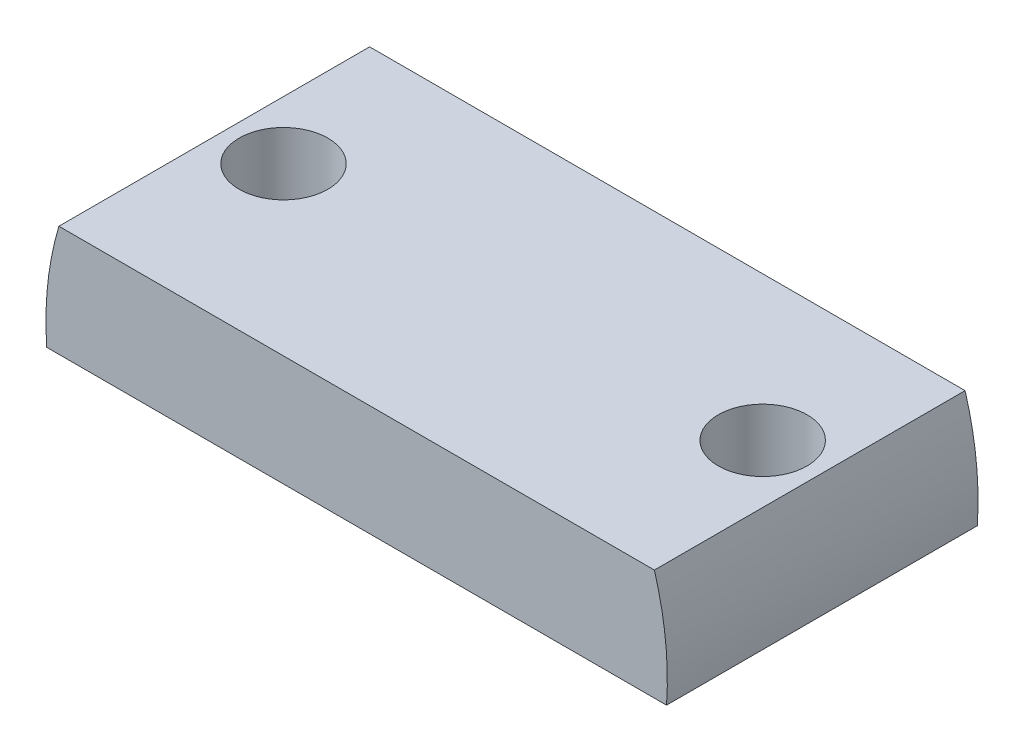
ISO-10303-21;
HEADER;
FILE_DESCRIPTION(('STEP AP214'),'2;1');
FILE_NAME('part.step','',(''),(''),'','','');
FILE_SCHEMA(('AUTOMOTIVE_DESIGN { 1 0 10303 214 1 1 1 1 }'));
ENDSEC;
DATA;
#1=APPLICATION_CONTEXT('core data for automotive mechanical design processes');
#2=APPLICATION_PROTOCOL_DEFINITION('international standard','automotive_design',2000,#1);
#3=PRODUCT_CONTEXT('',#1,'mechanical');
#4=PRODUCT('Part','Part','',(#3));
#5=PRODUCT_RELATED_PRODUCT_CATEGORY('part','',(#4));
#6=PRODUCT_DEFINITION_FORMATION('','',#4);
#7=PRODUCT_DEFINITION_CONTEXT('part definition',#1,'design');
#8=PRODUCT_DEFINITION('design','',#6,#7);
#9=PRODUCT_DEFINITION_SHAPE('','',#8);
#10=(LENGTH_UNIT() NAMED_UNIT(*) SI_UNIT(.MILLI.,.METRE.));
#11=(NAMED_UNIT(*) PLANE_ANGLE_UNIT() SI_UNIT($,.RADIAN.));
#12=(NAMED_UNIT(*) SI_UNIT($,.STERADIAN.) SOLID_ANGLE_UNIT());
#13=UNCERTAINTY_MEASURE_WITH_UNIT(LENGTH_MEASURE(1.E-05),#10,'distance_accuracy_value','');
#14=(GEOMETRIC_REPRESENTATION_CONTEXT(3) GLOBAL_UNCERTAINTY_ASSIGNED_CONTEXT((#13)) GLOBAL_UNIT_ASSIGNED_CONTEXT((#10,
#11,#12)) REPRESENTATION_CONTEXT('',''));
#15=CARTESIAN_POINT('',(0.,0.,0.));
#16=DIRECTION('',(0.,0.,1.));
#17=DIRECTION('',(1.,0.,0.));
#18=AXIS2_PLACEMENT_3D('',#15,#16,#17);
#19=CARTESIAN_POINT('',(0.,3.99956576018979,15.));
#20=DIRECTION('',(0.,-1.,0.));
#21=DIRECTION('',(1.,0.,0.));
#22=AXIS2_PLACEMENT_3D('',#19,#20,#21);
#23=PLANE('',#22);
#24=CARTESIAN_POINT('',(10.795,3.99956576018979,7.5));
#25=DIRECTION('',(0.,1.,0.));
#26=DIRECTION('',(0.,0.,1.));
#27=AXIS2_PLACEMENT_3D('',#24,#25,#26);
#28=CIRCLE('',#27,2.);
#29=CARTESIAN_POINT('',(10.795,3.99956576018979,9.5));
#30=VERTEX_POINT('',#29);
#31=EDGE_CURVE('E127',#30,#30,#28,.T.);
#32=ORIENTED_EDGE('',*,*,#31,.F.);
#33=EDGE_LOOP('',(#32));
#34=FACE_BOUND('',#33,.T.);
#35=CARTESIAN_POINT('',(-10.795,3.99956576018979,7.5));
#36=DIRECTION('',(0.,1.,0.));
#37=DIRECTION('',(0.,0.,-1.));
#38=AXIS2_PLACEMENT_3D('',#35,#36,#37);
#39=CIRCLE('',#38,2.);
#40=CARTESIAN_POINT('',(-10.795,3.99956576018979,5.5));
#41=VERTEX_POINT('',#40);
#42=EDGE_CURVE('E130',#41,#41,#39,.T.);
#43=ORIENTED_EDGE('',*,*,#42,.F.);
#44=EDGE_LOOP('',(#43));
#45=FACE_BOUND('',#44,.T.);
#46=DIRECTION('',(0.,0.,-1.));
#47=VECTOR('',#46,1.);
#48=CARTESIAN_POINT('',(13.4149513803975,3.99956576018979,15.));
#49=LINE('',#48,#47);
#50=CARTESIAN_POINT('',(13.4149513803975,3.99956576018979,15.));
#51=VERTEX_POINT('',#50);
#52=CARTESIAN_POINT('',(13.4149513803975,3.99956576018979,1.));
#53=VERTEX_POINT('',#52);
#54=EDGE_CURVE('E84',#51,#53,#49,.T.);
#55=ORIENTED_EDGE('',*,*,#54,.T.);
#56=DIRECTION('',(-1.,0.,0.));
#57=VECTOR('',#56,1.);
#58=CARTESIAN_POINT('',(0.,3.99956576018979,1.));
#59=LINE('',#58,#57);
#60=CARTESIAN_POINT('',(-13.4149513803975,3.99956576018979,1.));
#61=VERTEX_POINT('',#60);
#62=EDGE_CURVE('E47',#53,#61,#59,.T.);
#63=ORIENTED_EDGE('',*,*,#62,.T.);
#64=DIRECTION('',(0.,0.,-1.));
#65=VECTOR('',#64,1.);
#66=CARTESIAN_POINT('',(-13.4149513803975,3.99956576018979,15.));
#67=LINE('',#66,#65);
#68=CARTESIAN_POINT('',(-13.4149513803975,3.99956576018979,15.));
#69=VERTEX_POINT('',#68);
#70=EDGE_CURVE('E11',#69,#61,#67,.T.);
#71=ORIENTED_EDGE('',*,*,#70,.F.);
#72=DIRECTION('',(-1.,0.,0.));
#73=VECTOR('',#72,1.);
#74=CARTESIAN_POINT('',(0.,3.99956576018979,15.));
#75=LINE('',#74,#73);
#76=EDGE_CURVE('E91',#51,#69,#75,.T.);
#77=ORIENTED_EDGE('',*,*,#76,.F.);
#78=EDGE_LOOP('',(#55,#63,#71,#77));
#79=FACE_BOUND('',#78,.T.);
#80=ADVANCED_FACE('F33',(#34,#45,#79),#23,.F.);
#81=CARTESIAN_POINT('',(0.,0.,15.));
#82=DIRECTION('',(0.,0.,-1.));
#83=DIRECTION('',(-1.,0.,0.));
#84=AXIS2_PLACEMENT_3D('',#81,#82,#83);
#85=CYLINDRICAL_SURFACE('',#84,13.9984801606643);
#86=ORIENTED_EDGE('',*,*,#70,.T.);
#87=CARTESIAN_POINT('',(0.,0.,1.));
#88=DIRECTION('',(0.,0.,1.));
#89=DIRECTION('',(1.,0.,0.));
#90=AXIS2_PLACEMENT_3D('',#87,#88,#89);
#91=CIRCLE('',#90,13.9984801606643);
#92=CARTESIAN_POINT('',(-13.9627163119685,-0.999999999999996,1.));
#93=VERTEX_POINT('',#92);
#94=EDGE_CURVE('E71',#61,#93,#91,.T.);
#95=ORIENTED_EDGE('',*,*,#94,.T.);
#96=DIRECTION('',(0.,0.,-1.));
#97=VECTOR('',#96,1.);
#98=CARTESIAN_POINT('',(-13.9627163119685,-0.999999999999996,15.));
#99=LINE('',#98,#97);
#100=CARTESIAN_POINT('',(-13.9627163119685,-0.999999999999996,15.));
#101=VERTEX_POINT('',#100);
#102=EDGE_CURVE('E40',#101,#93,#99,.T.);
#103=ORIENTED_EDGE('',*,*,#102,.F.);
#104=CARTESIAN_POINT('',(0.,0.,15.));
#105=DIRECTION('',(0.,0.,1.));
#106=DIRECTION('',(1.,0.,0.));
#107=AXIS2_PLACEMENT_3D('',#104,#105,#106);
#108=CIRCLE('',#107,13.9984801606643);
#109=EDGE_CURVE('E88',#69,#101,#108,.T.);
#110=ORIENTED_EDGE('',*,*,#109,.F.);
#111=EDGE_LOOP('',(#86,#95,#103,#110));
#112=FACE_BOUND('',#111,.T.);
#113=ADVANCED_FACE('F87',(#112),#85,.T.);
#114=CARTESIAN_POINT('',(0.,-1.,15.));
#115=DIRECTION('',(0.,1.,0.));
#116=DIRECTION('',(-1.,0.,0.));
#117=AXIS2_PLACEMENT_3D('',#114,#115,#116);
#118=PLANE('',#117);
#119=CARTESIAN_POINT('',(10.795,-1.,7.5));
#120=DIRECTION('',(0.,1.,0.));
#121=DIRECTION('',(0.,0.,1.));
#122=AXIS2_PLACEMENT_3D('',#119,#120,#121);
#123=CIRCLE('',#122,2.);
#124=CARTESIAN_POINT('',(10.795,-1.,9.5));
#125=VERTEX_POINT('',#124);
#126=EDGE_CURVE('E132',#125,#125,#123,.T.);
#127=ORIENTED_EDGE('',*,*,#126,.T.);
#128=EDGE_LOOP('',(#127));
#129=FACE_BOUND('',#128,.T.);
#130=CARTESIAN_POINT('',(-10.795,-1.,7.5));
#131=DIRECTION('',(0.,1.,0.));
#132=DIRECTION('',(0.,0.,-1.));
#133=AXIS2_PLACEMENT_3D('',#130,#131,#132);
#134=CIRCLE('',#133,2.);
#135=CARTESIAN_POINT('',(-10.795,-1.,5.5));
#136=VERTEX_POINT('',#135);
#137=EDGE_CURVE('E94',#136,#136,#134,.T.);
#138=ORIENTED_EDGE('',*,*,#137,.T.);
#139=EDGE_LOOP('',(#138));
#140=FACE_BOUND('',#139,.T.);
#141=ORIENTED_EDGE('',*,*,#102,.T.);
#142=DIRECTION('',(1.,0.,0.));
#143=VECTOR('',#142,1.);
#144=CARTESIAN_POINT('',(13.9627163119685,-1.,1.));
#145=LINE('',#144,#143);
#146=CARTESIAN_POINT('',(13.9627163119685,-1.,1.));
#147=VERTEX_POINT('',#146);
#148=EDGE_CURVE('E74',#93,#147,#145,.T.);
#149=ORIENTED_EDGE('',*,*,#148,.T.);
#150=DIRECTION('',(0.,0.,-1.));
#151=VECTOR('',#150,1.);
#152=CARTESIAN_POINT('',(13.9627163119685,-1.,15.));
#153=LINE('',#152,#151);
#154=CARTESIAN_POINT('',(13.9627163119685,-1.,15.));
#155=VERTEX_POINT('',#154);
#156=EDGE_CURVE('E100',#155,#147,#153,.T.);
#157=ORIENTED_EDGE('',*,*,#156,.F.);
#158=DIRECTION('',(1.,0.,0.));
#159=VECTOR('',#158,1.);
#160=CARTESIAN_POINT('',(0.,-1.,15.));
#161=LINE('',#160,#159);
#162=EDGE_CURVE('E90',#101,#155,#161,.T.);
#163=ORIENTED_EDGE('',*,*,#162,.F.);
#164=EDGE_LOOP('',(#141,#149,#157,#163));
#165=FACE_BOUND('',#164,.T.);
#166=ADVANCED_FACE('F103',(#129,#140,#165),#118,.F.);
#167=CARTESIAN_POINT('',(0.,0.,15.));
#168=DIRECTION('',(0.,0.,-1.));
#169=DIRECTION('',(-1.,0.,0.));
#170=AXIS2_PLACEMENT_3D('',#167,#168,#169);
#171=CYLINDRICAL_SURFACE('',#170,13.9984801606643);
#172=ORIENTED_EDGE('',*,*,#156,.T.);
#173=CARTESIAN_POINT('',(0.,0.,1.));
#174=DIRECTION('',(0.,0.,1.));
#175=DIRECTION('',(1.,0.,0.));
#176=AXIS2_PLACEMENT_3D('',#173,#174,#175);
#177=CIRCLE('',#176,13.9984801606643);
#178=EDGE_CURVE('E85',#147,#53,#177,.T.);
#179=ORIENTED_EDGE('',*,*,#178,.T.);
#180=ORIENTED_EDGE('',*,*,#54,.F.);
#181=CARTESIAN_POINT('',(0.,0.,15.));
#182=DIRECTION('',(0.,0.,1.));
#183=DIRECTION('',(1.,0.,0.));
#184=AXIS2_PLACEMENT_3D('',#181,#182,#183);
#185=CIRCLE('',#184,13.9984801606643);
#186=EDGE_CURVE('E55',#155,#51,#185,.T.);
#187=ORIENTED_EDGE('',*,*,#186,.F.);
#188=EDGE_LOOP('',(#172,#179,#180,#187));
#189=FACE_BOUND('',#188,.T.);
#190=ADVANCED_FACE('F108',(#189),#171,.T.);
#191=CARTESIAN_POINT('',(0.,0.,15.));
#192=DIRECTION('',(0.,0.,1.));
#193=DIRECTION('',(1.,0.,0.));
#194=AXIS2_PLACEMENT_3D('',#191,#192,#193);
#195=PLANE('',#194);
#196=ORIENTED_EDGE('',*,*,#76,.T.);
#197=ORIENTED_EDGE('',*,*,#109,.T.);
#198=ORIENTED_EDGE('',*,*,#162,.T.);
#199=ORIENTED_EDGE('',*,*,#186,.T.);
#200=EDGE_LOOP('',(#196,#197,#198,#199));
#201=FACE_BOUND('',#200,.T.);
#202=ADVANCED_FACE('F105',(#201),#195,.T.);
#203=CARTESIAN_POINT('',(-10.795,-1.,7.5));
#204=DIRECTION('',(0.,1.,0.));
#205=DIRECTION('',(0.,0.,1.));
#206=AXIS2_PLACEMENT_3D('',#203,#204,#205);
#207=CYLINDRICAL_SURFACE('',#206,2.);
#208=ORIENTED_EDGE('',*,*,#137,.F.);
#209=EDGE_LOOP('',(#208));
#210=FACE_BOUND('',#209,.T.);
#211=ORIENTED_EDGE('',*,*,#42,.T.);
#212=EDGE_LOOP('',(#211));
#213=FACE_BOUND('',#212,.T.);
#214=ADVANCED_FACE('F107',(#210,#213),#207,.F.);
#215=CARTESIAN_POINT('',(10.795,-1.,7.5));
#216=DIRECTION('',(0.,1.,0.));
#217=DIRECTION('',(0.,0.,1.));
#218=AXIS2_PLACEMENT_3D('',#215,#216,#217);
#219=CYLINDRICAL_SURFACE('',#218,2.);
#220=ORIENTED_EDGE('',*,*,#126,.F.);
#221=EDGE_LOOP('',(#220));
#222=FACE_BOUND('',#221,.T.);
#223=ORIENTED_EDGE('',*,*,#31,.T.);
#224=EDGE_LOOP('',(#223));
#225=FACE_BOUND('',#224,.T.);
#226=ADVANCED_FACE('F114',(#222,#225),#219,.F.);
#227=CARTESIAN_POINT('',(0.,0.,1.));
#228=DIRECTION('',(0.,0.,1.));
#229=DIRECTION('',(1.,0.,0.));
#230=AXIS2_PLACEMENT_3D('',#227,#228,#229);
#231=PLANE('',#230);
#232=ORIENTED_EDGE('',*,*,#178,.F.);
#233=ORIENTED_EDGE('',*,*,#148,.F.);
#234=ORIENTED_EDGE('',*,*,#94,.F.);
#235=ORIENTED_EDGE('',*,*,#62,.F.);
#236=EDGE_LOOP('',(#232,#233,#234,#235));
#237=FACE_BOUND('',#236,.T.);
#238=ADVANCED_FACE('F72',(#237),#231,.F.);
#239=CLOSED_SHELL('',(#80,#113,#166,#190,#202,#214,#226,#238));
#240=MANIFOLD_SOLID_BREP('B2',#239);
#241=ADVANCED_BREP_SHAPE_REPRESENTATION('',(#18,#240),#14);
#242=SHAPE_DEFINITION_REPRESENTATION(#9,#241);
ENDSEC;
END-ISO-10303-21;
